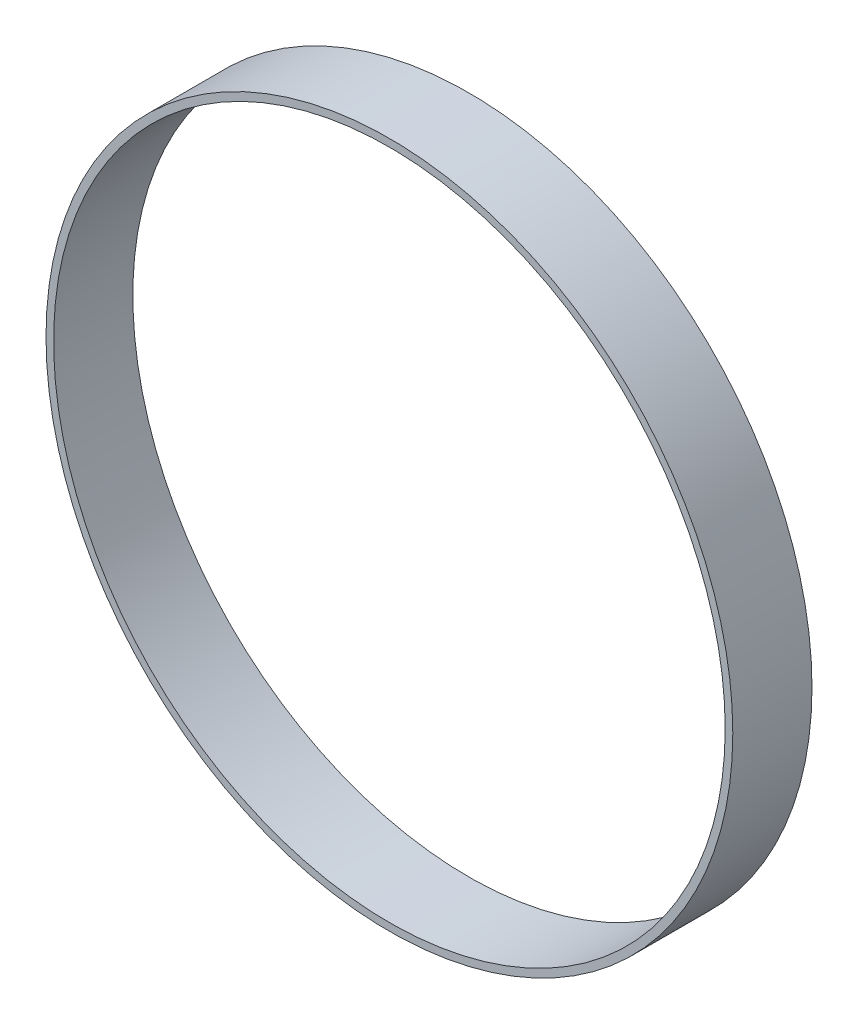
ISO-10303-21;
HEADER;
FILE_DESCRIPTION(('STEP AP214'),'2;1');
FILE_NAME('part.step','',(''),(''),'','','');
FILE_SCHEMA(('AUTOMOTIVE_DESIGN { 1 0 10303 214 1 1 1 1 }'));
ENDSEC;
DATA;
#1=APPLICATION_CONTEXT('core data for automotive mechanical design processes');
#2=APPLICATION_PROTOCOL_DEFINITION('international standard','automotive_design',2000,#1);
#3=PRODUCT_CONTEXT('',#1,'mechanical');
#4=PRODUCT('Part','Part','',(#3));
#5=PRODUCT_RELATED_PRODUCT_CATEGORY('part','',(#4));
#6=PRODUCT_DEFINITION_FORMATION('','',#4);
#7=PRODUCT_DEFINITION_CONTEXT('part definition',#1,'design');
#8=PRODUCT_DEFINITION('design','',#6,#7);
#9=PRODUCT_DEFINITION_SHAPE('','',#8);
#10=(LENGTH_UNIT() NAMED_UNIT(*) SI_UNIT(.MILLI.,.METRE.));
#11=(NAMED_UNIT(*) PLANE_ANGLE_UNIT() SI_UNIT($,.RADIAN.));
#12=(NAMED_UNIT(*) SI_UNIT($,.STERADIAN.) SOLID_ANGLE_UNIT());
#13=UNCERTAINTY_MEASURE_WITH_UNIT(LENGTH_MEASURE(1.E-05),#10,'distance_accuracy_value','');
#14=(GEOMETRIC_REPRESENTATION_CONTEXT(3) GLOBAL_UNCERTAINTY_ASSIGNED_CONTEXT((#13)) GLOBAL_UNIT_ASSIGNED_CONTEXT((#10,
#11,#12)) REPRESENTATION_CONTEXT('',''));
#15=CARTESIAN_POINT('',(0.,0.,0.));
#16=DIRECTION('',(0.,0.,1.));
#17=DIRECTION('',(1.,0.,0.));
#18=AXIS2_PLACEMENT_3D('',#15,#16,#17);
#19=CARTESIAN_POINT('',(49.2925242811873,35.3456699585659,-12.5));
#20=DIRECTION('',(0.,0.,1.));
#21=DIRECTION('',(1.,0.,0.));
#22=AXIS2_PLACEMENT_3D('',#19,#20,#21);
#23=CYLINDRICAL_SURFACE('',#22,54.2);
#24=CARTESIAN_POINT('',(49.2925242811873,35.3456699585659,-12.5));
#25=DIRECTION('',(0.,0.,1.));
#26=DIRECTION('',(1.,0.,0.));
#27=AXIS2_PLACEMENT_3D('',#24,#25,#26);
#28=CIRCLE('',#27,54.2);
#29=CARTESIAN_POINT('',(103.492524281187,35.3456699585659,-12.5));
#30=VERTEX_POINT('',#29);
#31=EDGE_CURVE('E10',#30,#30,#28,.T.);
#32=ORIENTED_EDGE('',*,*,#31,.T.);
#33=EDGE_LOOP('',(#32));
#34=FACE_BOUND('',#33,.T.);
#35=CARTESIAN_POINT('',(49.2925242811873,35.3456699585659,0.));
#36=DIRECTION('',(0.,0.,1.));
#37=DIRECTION('',(1.,0.,0.));
#38=AXIS2_PLACEMENT_3D('',#35,#36,#37);
#39=CIRCLE('',#38,54.2);
#40=CARTESIAN_POINT('',(103.492524281187,35.3456699585659,0.));
#41=VERTEX_POINT('',#40);
#42=EDGE_CURVE('E52',#41,#41,#39,.T.);
#43=ORIENTED_EDGE('',*,*,#42,.F.);
#44=EDGE_LOOP('',(#43));
#45=FACE_BOUND('',#44,.T.);
#46=ADVANCED_FACE('F49',(#34,#45),#23,.T.);
#47=CARTESIAN_POINT('',(49.2925242811873,35.3456699585659,-12.5));
#48=DIRECTION('',(0.,0.,1.));
#49=DIRECTION('',(1.,0.,0.));
#50=AXIS2_PLACEMENT_3D('',#47,#48,#49);
#51=PLANE('',#50);
#52=CARTESIAN_POINT('',(49.2925242811873,35.3456699585659,-12.5));
#53=DIRECTION('',(0.,0.,1.));
#54=DIRECTION('',(1.,0.,0.));
#55=AXIS2_PLACEMENT_3D('',#52,#53,#54);
#56=CIRCLE('',#55,53.);
#57=CARTESIAN_POINT('',(102.292524281187,35.3456699585659,-12.5));
#58=VERTEX_POINT('',#57);
#59=EDGE_CURVE('E61',#58,#58,#56,.T.);
#60=ORIENTED_EDGE('',*,*,#59,.T.);
#61=EDGE_LOOP('',(#60));
#62=FACE_BOUND('',#61,.T.);
#63=ORIENTED_EDGE('',*,*,#31,.F.);
#64=EDGE_LOOP('',(#63));
#65=FACE_BOUND('',#64,.T.);
#66=ADVANCED_FACE('F71',(#62,#65),#51,.F.);
#67=CARTESIAN_POINT('',(49.2925242811873,35.3456699585659,0.));
#68=DIRECTION('',(0.,0.,1.));
#69=DIRECTION('',(1.,0.,0.));
#70=AXIS2_PLACEMENT_3D('',#67,#68,#69);
#71=PLANE('',#70);
#72=CARTESIAN_POINT('',(49.2925242811873,35.3456699585659,0.));
#73=DIRECTION('',(0.,0.,1.));
#74=DIRECTION('',(1.,0.,0.));
#75=AXIS2_PLACEMENT_3D('',#72,#73,#74);
#76=CIRCLE('',#75,53.);
#77=CARTESIAN_POINT('',(102.292524281187,35.3456699585659,0.));
#78=VERTEX_POINT('',#77);
#79=EDGE_CURVE('E63',#78,#78,#76,.T.);
#80=ORIENTED_EDGE('',*,*,#79,.F.);
#81=EDGE_LOOP('',(#80));
#82=FACE_BOUND('',#81,.T.);
#83=ORIENTED_EDGE('',*,*,#42,.T.);
#84=EDGE_LOOP('',(#83));
#85=FACE_BOUND('',#84,.T.);
#86=ADVANCED_FACE('F77',(#82,#85),#71,.T.);
#87=CARTESIAN_POINT('',(49.2925242811873,35.3456699585659,-12.5));
#88=DIRECTION('',(0.,0.,1.));
#89=DIRECTION('',(1.,0.,0.));
#90=AXIS2_PLACEMENT_3D('',#87,#88,#89);
#91=CYLINDRICAL_SURFACE('',#90,53.);
#92=ORIENTED_EDGE('',*,*,#59,.F.);
#93=EDGE_LOOP('',(#92));
#94=FACE_BOUND('',#93,.T.);
#95=ORIENTED_EDGE('',*,*,#79,.T.);
#96=EDGE_LOOP('',(#95));
#97=FACE_BOUND('',#96,.T.);
#98=ADVANCED_FACE('F74',(#94,#97),#91,.F.);
#99=CLOSED_SHELL('',(#46,#66,#86,#98));
#100=MANIFOLD_SOLID_BREP('B2',#99);
#101=ADVANCED_BREP_SHAPE_REPRESENTATION('',(#18,#100),#14);
#102=SHAPE_DEFINITION_REPRESENTATION(#9,#101);
ENDSEC;
END-ISO-10303-21;
